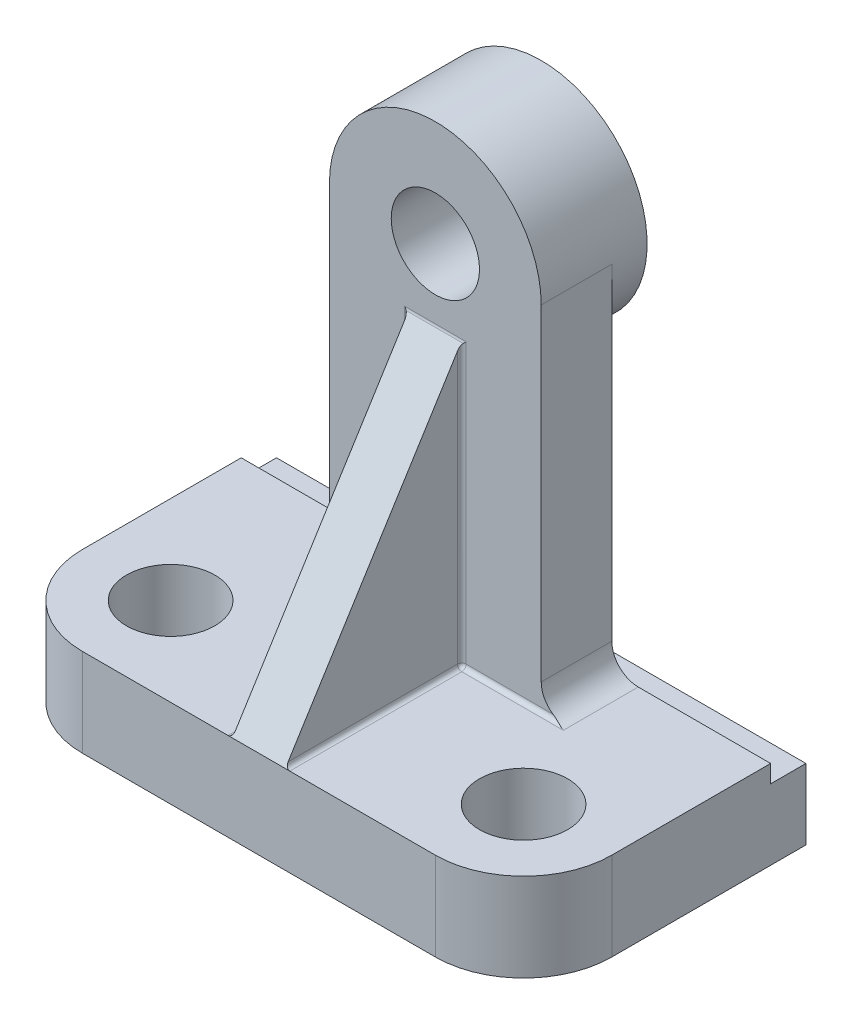
ISO-10303-21;
HEADER;
FILE_DESCRIPTION(('STEP AP214'),'2;1');
FILE_NAME('part.step','',(''),(''),'','','');
FILE_SCHEMA(('AUTOMOTIVE_DESIGN { 1 0 10303 214 1 1 1 1 }'));
ENDSEC;
DATA;
#1=APPLICATION_CONTEXT('core data for automotive mechanical design processes');
#2=APPLICATION_PROTOCOL_DEFINITION('international standard','automotive_design',2000,#1);
#3=PRODUCT_CONTEXT('',#1,'mechanical');
#4=PRODUCT('Part','Part','',(#3));
#5=PRODUCT_RELATED_PRODUCT_CATEGORY('part','',(#4));
#6=PRODUCT_DEFINITION_FORMATION('','',#4);
#7=PRODUCT_DEFINITION_CONTEXT('part definition',#1,'design');
#8=PRODUCT_DEFINITION('design','',#6,#7);
#9=PRODUCT_DEFINITION_SHAPE('','',#8);
#10=(LENGTH_UNIT() NAMED_UNIT(*) SI_UNIT(.MILLI.,.METRE.));
#11=(NAMED_UNIT(*) PLANE_ANGLE_UNIT() SI_UNIT($,.RADIAN.));
#12=(NAMED_UNIT(*) SI_UNIT($,.STERADIAN.) SOLID_ANGLE_UNIT());
#13=UNCERTAINTY_MEASURE_WITH_UNIT(LENGTH_MEASURE(1.E-05),#10,'distance_accuracy_value','');
#14=(GEOMETRIC_REPRESENTATION_CONTEXT(3) GLOBAL_UNCERTAINTY_ASSIGNED_CONTEXT((#13)) GLOBAL_UNIT_ASSIGNED_CONTEXT((#10,
#11,#12)) REPRESENTATION_CONTEXT('',''));
#15=CARTESIAN_POINT('',(0.,0.,0.));
#16=DIRECTION('',(0.,0.,1.));
#17=DIRECTION('',(1.,0.,0.));
#18=AXIS2_PLACEMENT_3D('',#15,#16,#17);
#19=CARTESIAN_POINT('',(-64.708154954579,20.,-20.));
#20=DIRECTION('',(0.,-1.,0.));
#21=DIRECTION('',(0.,0.,-1.));
#22=AXIS2_PLACEMENT_3D('',#19,#20,#21);
#23=PLANE('',#22);
#24=CARTESIAN_POINT('',(15.291845045421,20.,-20.));
#25=DIRECTION('',(0.,1.,0.));
#26=DIRECTION('',(0.,0.,1.));
#27=AXIS2_PLACEMENT_3D('',#24,#25,#26);
#28=CIRCLE('',#27,10.);
#29=CARTESIAN_POINT('',(15.291845045421,20.,-10.));
#30=VERTEX_POINT('',#29);
#31=EDGE_CURVE('E312',#30,#30,#28,.T.);
#32=ORIENTED_EDGE('',*,*,#31,.F.);
#33=EDGE_LOOP('',(#32));
#34=FACE_BOUND('',#33,.T.);
#35=DIRECTION('',(0.,0.,-1.));
#36=VECTOR('',#35,1.);
#37=CARTESIAN_POINT('',(5.29184504542103,20.,-40.));
#38=LINE('',#37,#36);
#39=CARTESIAN_POINT('',(5.29184504542103,20.,-39.));
#40=VERTEX_POINT('',#39);
#41=CARTESIAN_POINT('',(5.291845045421,20.,-56.));
#42=VERTEX_POINT('',#41);
#43=EDGE_CURVE('E272',#40,#42,#38,.T.);
#44=ORIENTED_EDGE('',*,*,#43,.F.);
#45=DIRECTION('',(-1.,0.,0.));
#46=VECTOR('',#45,1.);
#47=CARTESIAN_POINT('',(-64.708154954579,20.,-39.));
#48=LINE('',#47,#46);
#49=CARTESIAN_POINT('',(-17.708154954579,20.,-39.));
#50=VERTEX_POINT('',#49);
#51=EDGE_CURVE('E414',#40,#50,#48,.T.);
#52=ORIENTED_EDGE('',*,*,#51,.T.);
#53=DIRECTION('',(0.,0.,-1.));
#54=VECTOR('',#53,1.);
#55=CARTESIAN_POINT('',(-17.708154954579,20.,0.));
#56=LINE('',#55,#54);
#57=CARTESIAN_POINT('',(-17.7081549545789,20.,0.));
#58=VERTEX_POINT('',#57);
#59=EDGE_CURVE('E410',#50,#58,#56,.F.);
#60=ORIENTED_EDGE('',*,*,#59,.T.);
#61=DIRECTION('',(1.,0.,0.));
#62=VECTOR('',#61,1.);
#63=CARTESIAN_POINT('',(-64.708154954579,20.,0.));
#64=LINE('',#63,#62);
#65=CARTESIAN_POINT('',(15.291845045421,20.,0.));
#66=VERTEX_POINT('',#65);
#67=EDGE_CURVE('E332',#58,#66,#64,.T.);
#68=ORIENTED_EDGE('',*,*,#67,.T.);
#69=CARTESIAN_POINT('',(15.291845045421,20.,-20.));
#70=DIRECTION('',(0.,1.,0.));
#71=DIRECTION('',(0.,0.,1.));
#72=AXIS2_PLACEMENT_3D('',#69,#70,#71);
#73=CIRCLE('',#72,20.);
#74=CARTESIAN_POINT('',(35.291845045421,20.,-20.));
#75=VERTEX_POINT('',#74);
#76=EDGE_CURVE('E337',#66,#75,#73,.T.);
#77=ORIENTED_EDGE('',*,*,#76,.T.);
#78=DIRECTION('',(0.,0.,-1.));
#79=VECTOR('',#78,1.);
#80=CARTESIAN_POINT('',(35.291845045421,20.,-20.));
#81=LINE('',#80,#79);
#82=CARTESIAN_POINT('',(35.291845045421,20.,-56.));
#83=VERTEX_POINT('',#82);
#84=EDGE_CURVE('E340',#75,#83,#81,.T.);
#85=ORIENTED_EDGE('',*,*,#84,.T.);
#86=DIRECTION('',(1.,0.,0.));
#87=VECTOR('',#86,1.);
#88=CARTESIAN_POINT('',(-84.708154954579,20.,-56.));
#89=LINE('',#88,#87);
#90=EDGE_CURVE('E276',#42,#83,#89,.T.);
#91=ORIENTED_EDGE('',*,*,#90,.F.);
#92=EDGE_LOOP('',(#44,#52,#60,#68,#77,#85,#91));
#93=FACE_BOUND('',#92,.T.);
#94=ADVANCED_FACE('F51',(#34,#93),#23,.F.);
#95=CARTESIAN_POINT('',(-84.708154954579,16.,-56.));
#96=DIRECTION('',(0.,0.,1.));
#97=DIRECTION('',(1.,0.,0.));
#98=AXIS2_PLACEMENT_3D('',#95,#96,#97);
#99=PLANE('',#98);
#100=DIRECTION('',(0.,1.,0.));
#101=VECTOR('',#100,1.);
#102=CARTESIAN_POINT('',(-48.708154954579,26.,-56.));
#103=LINE('',#102,#101);
#104=CARTESIAN_POINT('',(-48.708154954579,26.,-56.));
#105=VERTEX_POINT('',#104);
#106=CARTESIAN_POINT('',(-48.708154954579,100.,-56.));
#107=VERTEX_POINT('',#106);
#108=EDGE_CURVE('E216',#105,#107,#103,.T.);
#109=ORIENTED_EDGE('',*,*,#108,.T.);
#110=CARTESIAN_POINT('',(-24.708154954579,100.,-56.));
#111=DIRECTION('',(0.,0.,-1.));
#112=DIRECTION('',(-1.,0.,0.));
#113=AXIS2_PLACEMENT_3D('',#110,#111,#112);
#114=CIRCLE('',#113,24.);
#115=CARTESIAN_POINT('',(-0.708154954578957,100.,-56.));
#116=VERTEX_POINT('',#115);
#117=EDGE_CURVE('E221',#116,#107,#114,.T.);
#118=ORIENTED_EDGE('',*,*,#117,.F.);
#119=DIRECTION('',(0.,-1.,0.));
#120=VECTOR('',#119,1.);
#121=CARTESIAN_POINT('',(-0.70815495457896,100.,-56.));
#122=LINE('',#121,#120);
#123=CARTESIAN_POINT('',(-0.70815495457897,26.,-56.));
#124=VERTEX_POINT('',#123);
#125=EDGE_CURVE('E204',#116,#124,#122,.T.);
#126=ORIENTED_EDGE('',*,*,#125,.T.);
#127=CARTESIAN_POINT('',(5.29184504542103,26.,-56.));
#128=DIRECTION('',(0.,0.,1.));
#129=DIRECTION('',(1.,0.,0.));
#130=AXIS2_PLACEMENT_3D('',#127,#128,#129);
#131=CIRCLE('',#130,6.);
#132=EDGE_CURVE('E215',#124,#42,#131,.T.);
#133=ORIENTED_EDGE('',*,*,#132,.T.);
#134=ORIENTED_EDGE('',*,*,#90,.T.);
#135=DIRECTION('',(0.,1.,0.));
#136=VECTOR('',#135,1.);
#137=CARTESIAN_POINT('',(35.291845045421,16.,-56.));
#138=LINE('',#137,#136);
#139=CARTESIAN_POINT('',(35.291845045421,16.,-56.));
#140=VERTEX_POINT('',#139);
#141=EDGE_CURVE('E305',#140,#83,#138,.T.);
#142=ORIENTED_EDGE('',*,*,#141,.F.);
#143=DIRECTION('',(1.,0.,0.));
#144=VECTOR('',#143,1.);
#145=CARTESIAN_POINT('',(-84.708154954579,16.,-56.));
#146=LINE('',#145,#144);
#147=CARTESIAN_POINT('',(-84.708154954579,16.,-56.));
#148=VERTEX_POINT('',#147);
#149=EDGE_CURVE('E291',#148,#140,#146,.T.);
#150=ORIENTED_EDGE('',*,*,#149,.F.);
#151=DIRECTION('',(0.,1.,0.));
#152=VECTOR('',#151,1.);
#153=CARTESIAN_POINT('',(-84.708154954579,16.,-56.));
#154=LINE('',#153,#152);
#155=CARTESIAN_POINT('',(-84.708154954579,20.,-56.));
#156=VERTEX_POINT('',#155);
#157=EDGE_CURVE('E301',#148,#156,#154,.T.);
#158=ORIENTED_EDGE('',*,*,#157,.T.);
#159=CARTESIAN_POINT('',(-54.708154954579,20.,-56.));
#160=VERTEX_POINT('',#159);
#161=EDGE_CURVE('E292',#156,#160,#89,.T.);
#162=ORIENTED_EDGE('',*,*,#161,.T.);
#163=CARTESIAN_POINT('',(-54.708154954579,26.,-56.));
#164=DIRECTION('',(0.,0.,1.));
#165=DIRECTION('',(1.,0.,0.));
#166=AXIS2_PLACEMENT_3D('',#163,#164,#165);
#167=CIRCLE('',#166,6.);
#168=EDGE_CURVE('E248',#160,#105,#167,.T.);
#169=ORIENTED_EDGE('',*,*,#168,.T.);
#170=EDGE_LOOP('',(#109,#118,#126,#133,#134,#142,#150,#158,#162,#169));
#171=FACE_BOUND('',#170,.T.);
#172=ADVANCED_FACE('F229',(#171),#99,.F.);
#173=CARTESIAN_POINT('',(-84.708154954579,20.,-64.));
#174=DIRECTION('',(0.,0.,1.));
#175=DIRECTION('',(1.,0.,0.));
#176=AXIS2_PLACEMENT_3D('',#173,#174,#175);
#177=PLANE('',#176);
#178=DIRECTION('',(0.,-1.,0.));
#179=VECTOR('',#178,1.);
#180=CARTESIAN_POINT('',(-84.708154954579,20.,-64.));
#181=LINE('',#180,#179);
#182=CARTESIAN_POINT('',(-84.708154954579,16.,-64.));
#183=VERTEX_POINT('',#182);
#184=CARTESIAN_POINT('',(-84.708154954579,0.,-64.));
#185=VERTEX_POINT('',#184);
#186=EDGE_CURVE('E369',#183,#185,#181,.T.);
#187=ORIENTED_EDGE('',*,*,#186,.F.);
#188=DIRECTION('',(-1.,0.,0.));
#189=VECTOR('',#188,1.);
#190=CARTESIAN_POINT('',(-84.708154954579,16.,-64.));
#191=LINE('',#190,#189);
#192=CARTESIAN_POINT('',(35.291845045421,16.,-64.));
#193=VERTEX_POINT('',#192);
#194=EDGE_CURVE('E298',#193,#183,#191,.T.);
#195=ORIENTED_EDGE('',*,*,#194,.F.);
#196=DIRECTION('',(0.,-1.,0.));
#197=VECTOR('',#196,1.);
#198=CARTESIAN_POINT('',(35.291845045421,20.,-64.));
#199=LINE('',#198,#197);
#200=CARTESIAN_POINT('',(35.291845045421,0.,-64.));
#201=VERTEX_POINT('',#200);
#202=EDGE_CURVE('E373',#193,#201,#199,.T.);
#203=ORIENTED_EDGE('',*,*,#202,.T.);
#204=DIRECTION('',(-1.,0.,0.));
#205=VECTOR('',#204,1.);
#206=CARTESIAN_POINT('',(-84.708154954579,0.,-64.));
#207=LINE('',#206,#205);
#208=EDGE_CURVE('E361',#201,#185,#207,.T.);
#209=ORIENTED_EDGE('',*,*,#208,.T.);
#210=EDGE_LOOP('',(#187,#195,#203,#209));
#211=FACE_BOUND('',#210,.T.);
#212=ADVANCED_FACE('F499',(#211),#177,.F.);
#213=DIRECTION('',(-1.,0.,0.));
#214=VECTOR('',#213,1.);
#215=CARTESIAN_POINT('',(-64.708154954579,20.,-39.));
#216=LINE('',#215,#214);
#217=CARTESIAN_POINT('',(-31.708154954579,20.,-39.));
#218=VERTEX_POINT('',#217);
#219=CARTESIAN_POINT('',(-54.708154954579,20.,-39.));
#220=VERTEX_POINT('',#219);
#221=EDGE_CURVE('E391',#218,#220,#216,.T.);
#222=ORIENTED_EDGE('',*,*,#221,.T.);
#223=DIRECTION('',(0.,0.,-1.));
#224=VECTOR('',#223,1.);
#225=CARTESIAN_POINT('',(-54.708154954579,20.,-40.));
#226=LINE('',#225,#224);
#227=EDGE_CURVE('E265',#220,#160,#226,.T.);
#228=ORIENTED_EDGE('',*,*,#227,.T.);
#229=ORIENTED_EDGE('',*,*,#161,.F.);
#230=DIRECTION('',(0.,0.,1.));
#231=VECTOR('',#230,1.);
#232=CARTESIAN_POINT('',(-84.708154954579,20.,-20.0000000000001));
#233=LINE('',#232,#231);
#234=CARTESIAN_POINT('',(-84.708154954579,20.,-20.0000000000001));
#235=VERTEX_POINT('',#234);
#236=EDGE_CURVE('E344',#156,#235,#233,.T.);
#237=ORIENTED_EDGE('',*,*,#236,.T.);
#238=CARTESIAN_POINT('',(-64.708154954579,20.,-20.));
#239=DIRECTION('',(0.,1.,0.));
#240=DIRECTION('',(0.,0.,-1.));
#241=AXIS2_PLACEMENT_3D('',#238,#239,#240);
#242=CIRCLE('',#241,20.);
#243=CARTESIAN_POINT('',(-64.708154954579,20.,0.));
#244=VERTEX_POINT('',#243);
#245=EDGE_CURVE('E328',#235,#244,#242,.T.);
#246=ORIENTED_EDGE('',*,*,#245,.T.);
#247=CARTESIAN_POINT('',(-31.708154954579,20.,0.));
#248=VERTEX_POINT('',#247);
#249=EDGE_CURVE('E334',#244,#248,#64,.T.);
#250=ORIENTED_EDGE('',*,*,#249,.T.);
#251=DIRECTION('',(0.,0.,-1.));
#252=VECTOR('',#251,1.);
#253=CARTESIAN_POINT('',(-31.708154954579,20.,-20.));
#254=LINE('',#253,#252);
#255=EDGE_CURVE('E388',#248,#218,#254,.T.);
#256=ORIENTED_EDGE('',*,*,#255,.T.);
#257=EDGE_LOOP('',(#222,#228,#229,#237,#246,#250,#256));
#258=FACE_BOUND('',#257,.T.);
#259=CARTESIAN_POINT('',(-64.708154954579,20.,-20.));
#260=DIRECTION('',(0.,1.,0.));
#261=DIRECTION('',(0.,0.,1.));
#262=AXIS2_PLACEMENT_3D('',#259,#260,#261);
#263=CIRCLE('',#262,10.);
#264=CARTESIAN_POINT('',(-64.708154954579,20.,-10.));
#265=VERTEX_POINT('',#264);
#266=EDGE_CURVE('E320',#265,#265,#263,.T.);
#267=ORIENTED_EDGE('',*,*,#266,.F.);
#268=EDGE_LOOP('',(#267));
#269=FACE_BOUND('',#268,.T.);
#270=ADVANCED_FACE('F495',(#258,#269),#23,.F.);
#271=CARTESIAN_POINT('',(-64.708154954579,0.,-20.));
#272=DIRECTION('',(0.,-1.,0.));
#273=DIRECTION('',(0.,0.,-1.));
#274=AXIS2_PLACEMENT_3D('',#271,#272,#273);
#275=PLANE('',#274);
#276=DIRECTION('',(0.,0.,1.));
#277=VECTOR('',#276,1.);
#278=CARTESIAN_POINT('',(-84.708154954579,0.,-20.0000000000001));
#279=LINE('',#278,#277);
#280=CARTESIAN_POINT('',(-84.708154954579,0.,-20.0000000000001));
#281=VERTEX_POINT('',#280);
#282=EDGE_CURVE('E333',#185,#281,#279,.T.);
#283=ORIENTED_EDGE('',*,*,#282,.F.);
#284=ORIENTED_EDGE('',*,*,#208,.F.);
#285=DIRECTION('',(0.,0.,-1.));
#286=VECTOR('',#285,1.);
#287=CARTESIAN_POINT('',(35.291845045421,0.,-20.));
#288=LINE('',#287,#286);
#289=CARTESIAN_POINT('',(35.291845045421,0.,-20.));
#290=VERTEX_POINT('',#289);
#291=EDGE_CURVE('E357',#290,#201,#288,.T.);
#292=ORIENTED_EDGE('',*,*,#291,.F.);
#293=CARTESIAN_POINT('',(15.291845045421,0.,-20.));
#294=DIRECTION('',(0.,1.,0.));
#295=DIRECTION('',(0.,0.,1.));
#296=AXIS2_PLACEMENT_3D('',#293,#294,#295);
#297=CIRCLE('',#296,20.);
#298=CARTESIAN_POINT('',(15.291845045421,0.,0.));
#299=VERTEX_POINT('',#298);
#300=EDGE_CURVE('E354',#299,#290,#297,.T.);
#301=ORIENTED_EDGE('',*,*,#300,.F.);
#302=DIRECTION('',(1.,0.,0.));
#303=VECTOR('',#302,1.);
#304=CARTESIAN_POINT('',(-64.708154954579,0.,0.));
#305=LINE('',#304,#303);
#306=CARTESIAN_POINT('',(-64.708154954579,0.,0.));
#307=VERTEX_POINT('',#306);
#308=EDGE_CURVE('E351',#307,#299,#305,.T.);
#309=ORIENTED_EDGE('',*,*,#308,.F.);
#310=CARTESIAN_POINT('',(-64.708154954579,0.,-20.));
#311=DIRECTION('',(0.,1.,0.));
#312=DIRECTION('',(0.,0.,-1.));
#313=AXIS2_PLACEMENT_3D('',#310,#311,#312);
#314=CIRCLE('',#313,20.);
#315=EDGE_CURVE('E324',#281,#307,#314,.T.);
#316=ORIENTED_EDGE('',*,*,#315,.F.);
#317=EDGE_LOOP('',(#283,#284,#292,#301,#309,#316));
#318=FACE_BOUND('',#317,.T.);
#319=CARTESIAN_POINT('',(-64.708154954579,0.,-20.));
#320=DIRECTION('',(0.,1.,0.));
#321=DIRECTION('',(0.,0.,1.));
#322=AXIS2_PLACEMENT_3D('',#319,#320,#321);
#323=CIRCLE('',#322,10.);
#324=CARTESIAN_POINT('',(-64.708154954579,0.,-10.));
#325=VERTEX_POINT('',#324);
#326=EDGE_CURVE('E316',#325,#325,#323,.T.);
#327=ORIENTED_EDGE('',*,*,#326,.T.);
#328=EDGE_LOOP('',(#327));
#329=FACE_BOUND('',#328,.T.);
#330=CARTESIAN_POINT('',(15.291845045421,0.,-20.));
#331=DIRECTION('',(0.,1.,0.));
#332=DIRECTION('',(0.,0.,1.));
#333=AXIS2_PLACEMENT_3D('',#330,#331,#332);
#334=CIRCLE('',#333,10.);
#335=CARTESIAN_POINT('',(15.291845045421,0.,-10.));
#336=VERTEX_POINT('',#335);
#337=EDGE_CURVE('E309',#336,#336,#334,.T.);
#338=ORIENTED_EDGE('',*,*,#337,.T.);
#339=EDGE_LOOP('',(#338));
#340=FACE_BOUND('',#339,.T.);
#341=ADVANCED_FACE('F506',(#318,#329,#340),#275,.T.);
#342=CARTESIAN_POINT('',(-64.708154954579,20.,-20.));
#343=DIRECTION('',(0.,-1.,0.));
#344=DIRECTION('',(0.,0.,-1.));
#345=AXIS2_PLACEMENT_3D('',#342,#343,#344);
#346=CYLINDRICAL_SURFACE('',#345,20.);
#347=ORIENTED_EDGE('',*,*,#315,.T.);
#348=DIRECTION('',(0.,-1.,0.));
#349=VECTOR('',#348,1.);
#350=CARTESIAN_POINT('',(-64.708154954579,20.,0.));
#351=LINE('',#350,#349);
#352=EDGE_CURVE('E384',#244,#307,#351,.T.);
#353=ORIENTED_EDGE('',*,*,#352,.F.);
#354=ORIENTED_EDGE('',*,*,#245,.F.);
#355=DIRECTION('',(0.,-1.,0.));
#356=VECTOR('',#355,1.);
#357=CARTESIAN_POINT('',(-84.708154954579,20.,-20.0000000000001));
#358=LINE('',#357,#356);
#359=EDGE_CURVE('E347',#235,#281,#358,.T.);
#360=ORIENTED_EDGE('',*,*,#359,.T.);
#361=EDGE_LOOP('',(#347,#353,#354,#360));
#362=FACE_BOUND('',#361,.T.);
#363=ADVANCED_FACE('F459',(#362),#346,.T.);
#364=CARTESIAN_POINT('',(-64.708154954579,20.,0.));
#365=DIRECTION('',(0.,0.,-1.));
#366=DIRECTION('',(-1.,0.,0.));
#367=AXIS2_PLACEMENT_3D('',#364,#365,#366);
#368=PLANE('',#367);
#369=ORIENTED_EDGE('',*,*,#308,.T.);
#370=DIRECTION('',(0.,-1.,0.));
#371=VECTOR('',#370,1.);
#372=CARTESIAN_POINT('',(15.291845045421,20.,0.));
#373=LINE('',#372,#371);
#374=EDGE_CURVE('E380',#66,#299,#373,.T.);
#375=ORIENTED_EDGE('',*,*,#374,.F.);
#376=ORIENTED_EDGE('',*,*,#67,.F.);
#377=DIRECTION('',(1.,0.,0.));
#378=VECTOR('',#377,1.);
#379=CARTESIAN_POINT('',(-64.708154954579,20.,0.));
#380=LINE('',#379,#378);
#381=EDGE_CURVE('E71',#248,#58,#380,.T.);
#382=ORIENTED_EDGE('',*,*,#381,.F.);
#383=ORIENTED_EDGE('',*,*,#249,.F.);
#384=ORIENTED_EDGE('',*,*,#352,.T.);
#385=EDGE_LOOP('',(#369,#375,#376,#382,#383,#384));
#386=FACE_BOUND('',#385,.T.);
#387=ADVANCED_FACE('F636',(#386),#368,.F.);
#388=CARTESIAN_POINT('',(15.291845045421,20.,-20.));
#389=DIRECTION('',(0.,-1.,0.));
#390=DIRECTION('',(0.,0.,-1.));
#391=AXIS2_PLACEMENT_3D('',#388,#389,#390);
#392=CYLINDRICAL_SURFACE('',#391,20.);
#393=ORIENTED_EDGE('',*,*,#300,.T.);
#394=DIRECTION('',(0.,-1.,0.));
#395=VECTOR('',#394,1.);
#396=CARTESIAN_POINT('',(35.291845045421,20.,-20.));
#397=LINE('',#396,#395);
#398=EDGE_CURVE('E376',#75,#290,#397,.T.);
#399=ORIENTED_EDGE('',*,*,#398,.F.);
#400=ORIENTED_EDGE('',*,*,#76,.F.);
#401=ORIENTED_EDGE('',*,*,#374,.T.);
#402=EDGE_LOOP('',(#393,#399,#400,#401));
#403=FACE_BOUND('',#402,.T.);
#404=ADVANCED_FACE('F893',(#403),#392,.T.);
#405=CARTESIAN_POINT('',(35.291845045421,20.,-20.));
#406=DIRECTION('',(-1.,0.,0.));
#407=DIRECTION('',(0.,0.,1.));
#408=AXIS2_PLACEMENT_3D('',#405,#406,#407);
#409=PLANE('',#408);
#410=DIRECTION('',(0.,0.,-1.));
#411=VECTOR('',#410,1.);
#412=CARTESIAN_POINT('',(35.291845045421,16.,-64.));
#413=LINE('',#412,#411);
#414=EDGE_CURVE('E295',#140,#193,#413,.T.);
#415=ORIENTED_EDGE('',*,*,#414,.F.);
#416=ORIENTED_EDGE('',*,*,#141,.T.);
#417=ORIENTED_EDGE('',*,*,#84,.F.);
#418=ORIENTED_EDGE('',*,*,#398,.T.);
#419=ORIENTED_EDGE('',*,*,#291,.T.);
#420=ORIENTED_EDGE('',*,*,#202,.F.);
#421=EDGE_LOOP('',(#415,#416,#417,#418,#419,#420));
#422=FACE_BOUND('',#421,.T.);
#423=ADVANCED_FACE('F551',(#422),#409,.F.);
#424=CARTESIAN_POINT('',(-84.708154954579,20.,-20.0000000000001));
#425=DIRECTION('',(1.,0.,0.));
#426=DIRECTION('',(0.,0.,-1.));
#427=AXIS2_PLACEMENT_3D('',#424,#425,#426);
#428=PLANE('',#427);
#429=ORIENTED_EDGE('',*,*,#236,.F.);
#430=ORIENTED_EDGE('',*,*,#157,.F.);
#431=DIRECTION('',(0.,0.,1.));
#432=VECTOR('',#431,1.);
#433=CARTESIAN_POINT('',(-84.708154954579,16.,-64.));
#434=LINE('',#433,#432);
#435=EDGE_CURVE('E287',#183,#148,#434,.T.);
#436=ORIENTED_EDGE('',*,*,#435,.F.);
#437=ORIENTED_EDGE('',*,*,#186,.T.);
#438=ORIENTED_EDGE('',*,*,#282,.T.);
#439=ORIENTED_EDGE('',*,*,#359,.F.);
#440=EDGE_LOOP('',(#429,#430,#436,#437,#438,#439));
#441=FACE_BOUND('',#440,.T.);
#442=ADVANCED_FACE('F523',(#441),#428,.F.);
#443=CARTESIAN_POINT('',(-64.708154954579,20.,-20.));
#444=DIRECTION('',(0.,-1.,0.));
#445=DIRECTION('',(0.,0.,-1.));
#446=AXIS2_PLACEMENT_3D('',#443,#444,#445);
#447=CYLINDRICAL_SURFACE('',#446,10.);
#448=ORIENTED_EDGE('',*,*,#266,.T.);
#449=EDGE_LOOP('',(#448));
#450=FACE_BOUND('',#449,.T.);
#451=ORIENTED_EDGE('',*,*,#326,.F.);
#452=EDGE_LOOP('',(#451));
#453=FACE_BOUND('',#452,.T.);
#454=ADVANCED_FACE('F519',(#450,#453),#447,.F.);
#455=CARTESIAN_POINT('',(15.291845045421,20.,-20.));
#456=DIRECTION('',(0.,-1.,0.));
#457=DIRECTION('',(0.,0.,-1.));
#458=AXIS2_PLACEMENT_3D('',#455,#456,#457);
#459=CYLINDRICAL_SURFACE('',#458,10.);
#460=ORIENTED_EDGE('',*,*,#31,.T.);
#461=EDGE_LOOP('',(#460));
#462=FACE_BOUND('',#461,.T.);
#463=ORIENTED_EDGE('',*,*,#337,.F.);
#464=EDGE_LOOP('',(#463));
#465=FACE_BOUND('',#464,.T.);
#466=ADVANCED_FACE('F522',(#462,#465),#459,.F.);
#467=CARTESIAN_POINT('',(0.,16.,0.));
#468=DIRECTION('',(0.,1.,0.));
#469=DIRECTION('',(0.,0.,1.));
#470=AXIS2_PLACEMENT_3D('',#467,#468,#469);
#471=PLANE('',#470);
#472=ORIENTED_EDGE('',*,*,#149,.T.);
#473=ORIENTED_EDGE('',*,*,#414,.T.);
#474=ORIENTED_EDGE('',*,*,#194,.T.);
#475=ORIENTED_EDGE('',*,*,#435,.T.);
#476=EDGE_LOOP('',(#472,#473,#474,#475));
#477=FACE_BOUND('',#476,.T.);
#478=ADVANCED_FACE('F530',(#477),#471,.T.);
#479=CARTESIAN_POINT('',(5.29184504542103,26.,-40.));
#480=DIRECTION('',(0.,0.,-1.));
#481=DIRECTION('',(-1.,0.,0.));
#482=AXIS2_PLACEMENT_3D('',#479,#480,#481);
#483=CYLINDRICAL_SURFACE('',#482,6.);
#484=ORIENTED_EDGE('',*,*,#132,.F.);
#485=DIRECTION('',(0.,0.,-1.));
#486=VECTOR('',#485,1.);
#487=CARTESIAN_POINT('',(-0.70815495457897,26.,-40.));
#488=LINE('',#487,#486);
#489=CARTESIAN_POINT('',(-0.70815495457897,26.,-40.));
#490=VERTEX_POINT('',#489);
#491=EDGE_CURVE('E210',#490,#124,#488,.T.);
#492=ORIENTED_EDGE('',*,*,#491,.F.);
#493=CARTESIAN_POINT('',(5.29184504542103,26.,-40.));
#494=DIRECTION('',(0.,0.,1.));
#495=DIRECTION('',(1.,0.,0.));
#496=AXIS2_PLACEMENT_3D('',#493,#494,#495);
#497=CIRCLE('',#496,6.);
#498=CARTESIAN_POINT('',(1.97522025506564,21.,-40.));
#499=VERTEX_POINT('',#498);
#500=EDGE_CURVE('E261',#490,#499,#497,.T.);
#501=ORIENTED_EDGE('',*,*,#500,.T.);
#502=CARTESIAN_POINT('',(1.97522025506564,21.,-40.));
#503=CARTESIAN_POINT('',(2.04595579507455,20.9530692628139,-39.999960889859));
#504=CARTESIAN_POINT('',(2.11763433057041,20.9076944713355,-39.9967001292477));
#505=CARTESIAN_POINT('',(2.26240212421996,20.8202715688812,-39.9847128710553));
#506=CARTESIAN_POINT('',(2.33548895884603,20.7782182846166,-39.9759950697934));
#507=CARTESIAN_POINT('',(2.48243694010388,20.6977158008875,-39.9541228058013));
#508=CARTESIAN_POINT('',(2.55629197464505,20.6592487724963,-39.940991971183));
#509=CARTESIAN_POINT('',(2.70495345474136,20.5856788043009,-39.9109976720676));
#510=CARTESIAN_POINT('',(2.77976042209126,20.5505778082295,-39.8941320692889));
#511=CARTESIAN_POINT('',(2.99078085339373,20.4567882720513,-39.8424252200398));
#512=CARTESIAN_POINT('',(3.12784316420478,20.4019175146588,-39.8040595026935));
#513=CARTESIAN_POINT('',(3.40360942857672,20.3029786219461,-39.7199831439616));
#514=CARTESIAN_POINT('',(3.54231424209158,20.2589164338242,-39.6742684817623));
#515=CARTESIAN_POINT('',(3.82127238940353,20.1811988817157,-39.5774342802611));
#516=CARTESIAN_POINT('',(3.96152931317533,20.1475781776246,-39.5262974802128));
#517=CARTESIAN_POINT('',(4.24270498292374,20.0906961784226,-39.4204457568417));
#518=CARTESIAN_POINT('',(4.38362342655457,20.0674305430729,-39.3657323436749));
#519=CARTESIAN_POINT('',(4.65008886876781,20.0330811465728,-39.2603565807877));
#520=CARTESIAN_POINT('',(4.77559213257536,20.0209258704582,-39.2099256489211));
#521=CARTESIAN_POINT('',(5.02657329581897,20.0045503704676,-39.1082817271839));
#522=CARTESIAN_POINT('',(5.15205089042001,20.0003169856652,-39.0570701771716));
#523=CARTESIAN_POINT('',(5.28228325194696,20.0000057158814,-39.0039035853255));
#524=CARTESIAN_POINT('',(5.28706417095817,20.0000000018403,-39.0019517831563));
#525=CARTESIAN_POINT('',(5.29184504542103,20.,-39.));
#526=B_SPLINE_CURVE_WITH_KNOTS('',3,(#502,#503,#504,#505,#506,#507,#508,#509,#510,#511,#512,
#513,#514,#515,#516,#517,#518,#519,#520,#521,#522,#523,#524,#525),.UNSPECIFIED.,.F.,.F.,(4,2,2,
2,2,2,2,2,2,2,2,4),(0.,0.254478765589331,0.508553023606619,0.761288041690675,1.01416813500991,
1.47107229962254,1.92822730548707,2.38688397976833,2.84534823055554,3.25253093781937,
3.65903657498634,3.6745285178593),.UNSPECIFIED.);
#527=EDGE_CURVE('E441',#499,#40,#526,.T.);
#528=ORIENTED_EDGE('',*,*,#527,.T.);
#529=ORIENTED_EDGE('',*,*,#43,.T.);
#530=EDGE_LOOP('',(#484,#492,#501,#528,#529));
#531=FACE_BOUND('',#530,.T.);
#532=ADVANCED_FACE('F536',(#531),#483,.F.);
#533=CARTESIAN_POINT('',(-0.70815495457896,100.,-40.));
#534=DIRECTION('',(1.,0.,0.));
#535=DIRECTION('',(0.,1.,0.));
#536=AXIS2_PLACEMENT_3D('',#533,#534,#535);
#537=PLANE('',#536);
#538=ORIENTED_EDGE('',*,*,#125,.F.);
#539=DIRECTION('',(0.,0.,-1.));
#540=VECTOR('',#539,1.);
#541=CARTESIAN_POINT('',(-0.70815495457896,100.,-40.));
#542=LINE('',#541,#540);
#543=CARTESIAN_POINT('',(-0.70815495457896,100.,-40.));
#544=VERTEX_POINT('',#543);
#545=EDGE_CURVE('E208',#544,#116,#542,.T.);
#546=ORIENTED_EDGE('',*,*,#545,.F.);
#547=DIRECTION('',(0.,-1.,0.));
#548=VECTOR('',#547,1.);
#549=CARTESIAN_POINT('',(-0.70815495457896,100.,-40.));
#550=LINE('',#549,#548);
#551=EDGE_CURVE('E258',#544,#490,#550,.T.);
#552=ORIENTED_EDGE('',*,*,#551,.T.);
#553=ORIENTED_EDGE('',*,*,#491,.T.);
#554=EDGE_LOOP('',(#538,#546,#552,#553));
#555=FACE_BOUND('',#554,.T.);
#556=ADVANCED_FACE('F206',(#555),#537,.T.);
#557=CARTESIAN_POINT('',(-24.708154954579,100.,-40.));
#558=DIRECTION('',(0.,0.,-1.));
#559=DIRECTION('',(-1.,0.,0.));
#560=AXIS2_PLACEMENT_3D('',#557,#558,#559);
#561=CYLINDRICAL_SURFACE('',#560,24.);
#562=CARTESIAN_POINT('',(-24.708154954579,100.,-64.));
#563=DIRECTION('',(0.,0.,-1.));
#564=DIRECTION('',(-1.,0.,0.));
#565=AXIS2_PLACEMENT_3D('',#562,#563,#564);
#566=CIRCLE('',#565,24.);
#567=CARTESIAN_POINT('',(-48.708154954579,100.,-64.));
#568=VERTEX_POINT('',#567);
#569=EDGE_CURVE('E233',#568,#568,#566,.T.);
#570=ORIENTED_EDGE('',*,*,#569,.F.);
#571=EDGE_LOOP('',(#570));
#572=FACE_BOUND('',#571,.T.);
#573=ORIENTED_EDGE('',*,*,#117,.T.);
#574=DIRECTION('',(0.,0.,-1.));
#575=VECTOR('',#574,1.);
#576=CARTESIAN_POINT('',(-48.708154954579,100.,-40.));
#577=LINE('',#576,#575);
#578=CARTESIAN_POINT('',(-48.708154954579,100.,-40.));
#579=VERTEX_POINT('',#578);
#580=EDGE_CURVE('E226',#579,#107,#577,.T.);
#581=ORIENTED_EDGE('',*,*,#580,.F.);
#582=CARTESIAN_POINT('',(-24.708154954579,100.,-40.));
#583=DIRECTION('',(0.,0.,-1.));
#584=DIRECTION('',(-1.,0.,0.));
#585=AXIS2_PLACEMENT_3D('',#582,#583,#584);
#586=CIRCLE('',#585,24.);
#587=EDGE_CURVE('E224',#579,#544,#586,.T.);
#588=ORIENTED_EDGE('',*,*,#587,.T.);
#589=ORIENTED_EDGE('',*,*,#545,.T.);
#590=EDGE_LOOP('',(#573,#581,#588,#589));
#591=FACE_BOUND('',#590,.T.);
#592=ADVANCED_FACE('F220',(#572,#591),#561,.T.);
#593=CARTESIAN_POINT('',(-48.708154954579,26.,-40.));
#594=DIRECTION('',(-1.,0.,0.));
#595=DIRECTION('',(0.,0.,1.));
#596=AXIS2_PLACEMENT_3D('',#593,#594,#595);
#597=PLANE('',#596);
#598=ORIENTED_EDGE('',*,*,#108,.F.);
#599=DIRECTION('',(0.,0.,-1.));
#600=VECTOR('',#599,1.);
#601=CARTESIAN_POINT('',(-48.708154954579,26.,-40.));
#602=LINE('',#601,#600);
#603=CARTESIAN_POINT('',(-48.708154954579,26.,-40.));
#604=VERTEX_POINT('',#603);
#605=EDGE_CURVE('E281',#604,#105,#602,.T.);
#606=ORIENTED_EDGE('',*,*,#605,.F.);
#607=DIRECTION('',(0.,1.,0.));
#608=VECTOR('',#607,1.);
#609=CARTESIAN_POINT('',(-48.708154954579,26.,-40.));
#610=LINE('',#609,#608);
#611=EDGE_CURVE('E252',#604,#579,#610,.T.);
#612=ORIENTED_EDGE('',*,*,#611,.T.);
#613=ORIENTED_EDGE('',*,*,#580,.T.);
#614=EDGE_LOOP('',(#598,#606,#612,#613));
#615=FACE_BOUND('',#614,.T.);
#616=ADVANCED_FACE('F685',(#615),#597,.T.);
#617=CARTESIAN_POINT('',(-54.708154954579,26.,-40.));
#618=DIRECTION('',(0.,0.,-1.));
#619=DIRECTION('',(-1.,0.,0.));
#620=AXIS2_PLACEMENT_3D('',#617,#618,#619);
#621=CYLINDRICAL_SURFACE('',#620,6.);
#622=ORIENTED_EDGE('',*,*,#168,.F.);
#623=ORIENTED_EDGE('',*,*,#227,.F.);
#624=CARTESIAN_POINT('',(-51.3915301642236,21.,-40.));
#625=CARTESIAN_POINT('',(-51.4622657042326,20.9530692628138,-39.999960889859));
#626=CARTESIAN_POINT('',(-51.5339442397287,20.9076944713354,-39.9967001292477));
#627=CARTESIAN_POINT('',(-51.6787120333785,20.8202715688808,-39.9847128710552));
#628=CARTESIAN_POINT('',(-51.7517988680048,20.7782182846162,-39.9759950697933));
#629=CARTESIAN_POINT('',(-51.8987468492627,20.6977158008871,-39.9541228058011));
#630=CARTESIAN_POINT('',(-51.9726018838037,20.659248772496,-39.9409919711828));
#631=CARTESIAN_POINT('',(-52.1212633638997,20.5856788043008,-39.9109976720675));
#632=CARTESIAN_POINT('',(-52.1960703312494,20.5505778082294,-39.8941320692888));
#633=CARTESIAN_POINT('',(-52.4070907625516,20.4567882720514,-39.8424252200399));
#634=CARTESIAN_POINT('',(-52.5441530733625,20.4019175146589,-39.8040595026935));
#635=CARTESIAN_POINT('',(-52.8199193377342,20.3029786219463,-39.7199831439618));
#636=CARTESIAN_POINT('',(-52.958624151249,20.2589164338243,-39.6742684817626));
#637=CARTESIAN_POINT('',(-53.2375822985609,20.1811988817159,-39.5774342802612));
#638=CARTESIAN_POINT('',(-53.3778392223327,20.1475781776246,-39.5262974802126));
#639=CARTESIAN_POINT('',(-53.6590148920817,20.0906961784226,-39.4204457568421));
#640=CARTESIAN_POINT('',(-53.799933335713,20.0674305430729,-39.3657323436763));
#641=CARTESIAN_POINT('',(-54.0663987779253,20.0330811465728,-39.2603565807865));
#642=CARTESIAN_POINT('',(-54.1919020417316,20.0209258704582,-39.2099256489167));
#643=CARTESIAN_POINT('',(-54.4428832049788,20.0045503704677,-39.1082817271883));
#644=CARTESIAN_POINT('',(-54.5683607995847,20.0003169856653,-39.057070177188));
#645=CARTESIAN_POINT('',(-54.6985931611054,20.0000057158814,-39.0039035853267));
#646=CARTESIAN_POINT('',(-54.7033740801164,20.0000000018403,-39.001951783157));
#647=CARTESIAN_POINT('',(-54.708154954579,20.,-39.));
#648=B_SPLINE_CURVE_WITH_KNOTS('',3,(#624,#625,#626,#627,#628,#629,#630,#631,#632,#633,#634,
#635,#636,#637,#638,#639,#640,#641,#642,#643,#644,#645,#646,#647),.UNSPECIFIED.,.F.,.F.,(4,2,2,
2,2,2,2,2,2,2,2,4),(0.,0.254478765589873,0.508553023607736,0.761288041691247,1.01416813500992,
1.47107229962212,1.92822730548632,2.38688397976803,2.8453482305556,3.25253093781942,
3.65903657498633,3.67452851785929),.UNSPECIFIED.);
#649=CARTESIAN_POINT('',(-51.3915301642236,21.,-40.));
#650=VERTEX_POINT('',#649);
#651=EDGE_CURVE('E432',#220,#650,#648,.F.);
#652=ORIENTED_EDGE('',*,*,#651,.T.);
#653=CARTESIAN_POINT('',(-54.708154954579,26.,-40.));
#654=DIRECTION('',(0.,0.,1.));
#655=DIRECTION('',(1.,0.,0.));
#656=AXIS2_PLACEMENT_3D('',#653,#654,#655);
#657=CIRCLE('',#656,6.);
#658=EDGE_CURVE('E249',#650,#604,#657,.T.);
#659=ORIENTED_EDGE('',*,*,#658,.T.);
#660=ORIENTED_EDGE('',*,*,#605,.T.);
#661=EDGE_LOOP('',(#622,#623,#652,#659,#660));
#662=FACE_BOUND('',#661,.T.);
#663=ADVANCED_FACE('F448',(#662),#621,.F.);
#664=CARTESIAN_POINT('',(-54.708154954579,26.,-40.));
#665=DIRECTION('',(0.,0.,1.));
#666=DIRECTION('',(1.,0.,0.));
#667=AXIS2_PLACEMENT_3D('',#664,#665,#666);
#668=PLANE('',#667);
#669=ORIENTED_EDGE('',*,*,#658,.F.);
#670=DIRECTION('',(-1.,0.,0.));
#671=VECTOR('',#670,1.);
#672=CARTESIAN_POINT('',(-54.708154954579,21.,-40.));
#673=LINE('',#672,#671);
#674=CARTESIAN_POINT('',(-31.708154954579,21.,-40.));
#675=VERTEX_POINT('',#674);
#676=EDGE_CURVE('E407',#650,#675,#673,.F.);
#677=ORIENTED_EDGE('',*,*,#676,.T.);
#678=DIRECTION('',(0.,-1.,0.));
#679=VECTOR('',#678,1.);
#680=CARTESIAN_POINT('',(-31.708154954579,84.,-40.));
#681=LINE('',#680,#679);
#682=CARTESIAN_POINT('',(-31.708154954579,84.2867962264113,-40.));
#683=VERTEX_POINT('',#682);
#684=EDGE_CURVE('E398',#675,#683,#681,.F.);
#685=ORIENTED_EDGE('',*,*,#684,.T.);
#686=DIRECTION('',(-1.,0.,0.));
#687=VECTOR('',#686,1.);
#688=CARTESIAN_POINT('',(-18.708154954579,84.2867962264113,-40.));
#689=LINE('',#688,#687);
#690=CARTESIAN_POINT('',(-17.708154954579,84.2867962264113,-40.));
#691=VERTEX_POINT('',#690);
#692=EDGE_CURVE('E395',#683,#691,#689,.F.);
#693=ORIENTED_EDGE('',*,*,#692,.T.);
#694=DIRECTION('',(0.,-1.,0.));
#695=VECTOR('',#694,1.);
#696=CARTESIAN_POINT('',(-17.708154954579,26.,-40.));
#697=LINE('',#696,#695);
#698=CARTESIAN_POINT('',(-17.708154954579,21.,-40.));
#699=VERTEX_POINT('',#698);
#700=EDGE_CURVE('E401',#691,#699,#697,.T.);
#701=ORIENTED_EDGE('',*,*,#700,.T.);
#702=DIRECTION('',(-1.,0.,0.));
#703=VECTOR('',#702,1.);
#704=CARTESIAN_POINT('',(-54.708154954579,21.,-40.));
#705=LINE('',#704,#703);
#706=EDGE_CURVE('E404',#699,#499,#705,.F.);
#707=ORIENTED_EDGE('',*,*,#706,.T.);
#708=ORIENTED_EDGE('',*,*,#500,.F.);
#709=ORIENTED_EDGE('',*,*,#551,.F.);
#710=ORIENTED_EDGE('',*,*,#587,.F.);
#711=ORIENTED_EDGE('',*,*,#611,.F.);
#712=EDGE_LOOP('',(#669,#677,#685,#693,#701,#707,#708,#709,#710,#711));
#713=FACE_BOUND('',#712,.T.);
#714=CARTESIAN_POINT('',(-24.708154954579,100.,-40.));
#715=DIRECTION('',(0.,0.,-1.));
#716=DIRECTION('',(-1.,0.,0.));
#717=AXIS2_PLACEMENT_3D('',#714,#715,#716);
#718=CIRCLE('',#717,10.);
#719=CARTESIAN_POINT('',(-34.708154954579,100.,-40.));
#720=VERTEX_POINT('',#719);
#721=EDGE_CURVE('E240',#720,#720,#718,.T.);
#722=ORIENTED_EDGE('',*,*,#721,.T.);
#723=EDGE_LOOP('',(#722));
#724=FACE_BOUND('',#723,.T.);
#725=ADVANCED_FACE('F569',(#713,#724),#668,.T.);
#726=CARTESIAN_POINT('',(-24.708154954579,100.,-40.));
#727=DIRECTION('',(0.,0.,-1.));
#728=DIRECTION('',(-1.,0.,0.));
#729=AXIS2_PLACEMENT_3D('',#726,#727,#728);
#730=CYLINDRICAL_SURFACE('',#729,10.);
#731=CARTESIAN_POINT('',(-24.708154954579,100.,-64.));
#732=DIRECTION('',(0.,0.,-1.));
#733=DIRECTION('',(-1.,0.,0.));
#734=AXIS2_PLACEMENT_3D('',#731,#732,#733);
#735=CIRCLE('',#734,10.);
#736=CARTESIAN_POINT('',(-34.708154954579,100.,-64.));
#737=VERTEX_POINT('',#736);
#738=EDGE_CURVE('E234',#737,#737,#735,.T.);
#739=ORIENTED_EDGE('',*,*,#738,.T.);
#740=EDGE_LOOP('',(#739));
#741=FACE_BOUND('',#740,.T.);
#742=ORIENTED_EDGE('',*,*,#721,.F.);
#743=EDGE_LOOP('',(#742));
#744=FACE_BOUND('',#743,.T.);
#745=ADVANCED_FACE('F674',(#741,#744),#730,.F.);
#746=CARTESIAN_POINT('',(-24.708154954579,100.,-64.));
#747=DIRECTION('',(0.,0.,-1.));
#748=DIRECTION('',(-1.,0.,0.));
#749=AXIS2_PLACEMENT_3D('',#746,#747,#748);
#750=PLANE('',#749);
#751=ORIENTED_EDGE('',*,*,#738,.F.);
#752=EDGE_LOOP('',(#751));
#753=FACE_BOUND('',#752,.T.);
#754=ORIENTED_EDGE('',*,*,#569,.T.);
#755=EDGE_LOOP('',(#754));
#756=FACE_BOUND('',#755,.T.);
#757=ADVANCED_FACE('F671',(#753,#756),#750,.T.);
#758=CARTESIAN_POINT('',(-24.708154954579,20.,0.));
#759=DIRECTION('',(0.,0.52999894000318,0.847998304005088));
#760=DIRECTION('',(0.,0.847998304005088,-0.52999894000318));
#761=AXIS2_PLACEMENT_3D('',#758,#759,#760);
#762=PLANE('',#761);
#763=CARTESIAN_POINT('',(-17.708154954579,82.4,-39.));
#764=DIRECTION('',(0.,0.52999894000318,0.847998304005088));
#765=DIRECTION('',(0.,-0.847998304005088,0.52999894000318));
#766=AXIS2_PLACEMENT_3D('',#763,#764,#765);
#767=ELLIPSE('',#766,1.88679622641132,1.);
#768=CARTESIAN_POINT('',(-18.708154954579,82.4,-39.));
#769=VERTEX_POINT('',#768);
#770=CARTESIAN_POINT('',(-18.2381538945902,83.7567972864082,-39.8479983040051));
#771=VERTEX_POINT('',#770);
#772=EDGE_CURVE('E63',#769,#771,#767,.F.);
#773=ORIENTED_EDGE('',*,*,#772,.T.);
#774=DIRECTION('',(-1.,0.,0.));
#775=VECTOR('',#774,1.);
#776=CARTESIAN_POINT('',(-30.708154954579,83.7567972864082,-39.8479983040051));
#777=LINE('',#776,#775);
#778=CARTESIAN_POINT('',(-31.1781560145677,83.7567972864082,-39.8479983040051));
#779=VERTEX_POINT('',#778);
#780=EDGE_CURVE('E429',#771,#779,#777,.T.);
#781=ORIENTED_EDGE('',*,*,#780,.T.);
#782=CARTESIAN_POINT('',(-31.708154954579,82.4,-39.));
#783=DIRECTION('',(0.,0.52999894000318,0.847998304005088));
#784=DIRECTION('',(0.,0.847998304005088,-0.52999894000318));
#785=AXIS2_PLACEMENT_3D('',#782,#783,#784);
#786=ELLIPSE('',#785,1.88679622641132,1.);
#787=CARTESIAN_POINT('',(-30.708154954579,82.4,-39.));
#788=VERTEX_POINT('',#787);
#789=EDGE_CURVE('E13',#779,#788,#786,.F.);
#790=ORIENTED_EDGE('',*,*,#789,.T.);
#791=DIRECTION('',(0.,0.847998304005088,-0.52999894000318));
#792=VECTOR('',#791,1.);
#793=CARTESIAN_POINT('',(-30.708154954579,20.,0.));
#794=LINE('',#793,#792);
#795=CARTESIAN_POINT('',(-30.708154954579,21.,-0.625000000000003));
#796=VERTEX_POINT('',#795);
#797=EDGE_CURVE('E613',#796,#788,#794,.T.);
#798=ORIENTED_EDGE('',*,*,#797,.F.);
#799=CARTESIAN_POINT('',(-31.708154954579,21.,-0.625000000000004));
#800=DIRECTION('',(0.,0.52999894000318,0.847998304005088));
#801=DIRECTION('',(0.,0.847998304005088,-0.52999894000318));
#802=AXIS2_PLACEMENT_3D('',#799,#800,#801);
#803=ELLIPSE('',#802,1.17924764150708,1.);
#804=EDGE_CURVE('E631',#796,#248,#803,.F.);
#805=ORIENTED_EDGE('',*,*,#804,.T.);
#806=ORIENTED_EDGE('',*,*,#381,.T.);
#807=CARTESIAN_POINT('',(-17.708154954579,21.,-0.625000000000001));
#808=DIRECTION('',(0.,0.52999894000318,0.847998304005088));
#809=DIRECTION('',(0.,-0.847998304005088,0.52999894000318));
#810=AXIS2_PLACEMENT_3D('',#807,#808,#809);
#811=ELLIPSE('',#810,1.17924764150708,1.);
#812=CARTESIAN_POINT('',(-18.7081549545789,21.,-0.625000000000002));
#813=VERTEX_POINT('',#812);
#814=EDGE_CURVE('E628',#58,#813,#811,.F.);
#815=ORIENTED_EDGE('',*,*,#814,.T.);
#816=DIRECTION('',(0.,0.847998304005088,-0.52999894000318));
#817=VECTOR('',#816,1.);
#818=CARTESIAN_POINT('',(-18.7081549545789,20.,0.));
#819=LINE('',#818,#817);
#820=EDGE_CURVE('E608',#813,#769,#819,.T.);
#821=ORIENTED_EDGE('',*,*,#820,.T.);
#822=EDGE_LOOP('',(#773,#781,#790,#798,#805,#806,#815,#821));
#823=FACE_BOUND('',#822,.T.);
#824=ADVANCED_FACE('F627',(#823),#762,.T.);
#825=CARTESIAN_POINT('',(-30.708154954579,62.,-32.));
#826=DIRECTION('',(-1.,0.,0.));
#827=DIRECTION('',(0.,0.,1.));
#828=AXIS2_PLACEMENT_3D('',#825,#826,#827);
#829=PLANE('',#828);
#830=DIRECTION('',(0.,-1.,0.));
#831=VECTOR('',#830,1.);
#832=CARTESIAN_POINT('',(-30.708154954579,20.,-39.));
#833=LINE('',#832,#831);
#834=CARTESIAN_POINT('',(-30.708154954579,21.,-39.));
#835=VERTEX_POINT('',#834);
#836=EDGE_CURVE('E417',#788,#835,#833,.T.);
#837=ORIENTED_EDGE('',*,*,#836,.T.);
#838=DIRECTION('',(0.,0.,-1.));
#839=VECTOR('',#838,1.);
#840=CARTESIAN_POINT('',(-30.708154954579,21.,-32.));
#841=LINE('',#840,#839);
#842=EDGE_CURVE('E420',#835,#796,#841,.F.);
#843=ORIENTED_EDGE('',*,*,#842,.T.);
#844=ORIENTED_EDGE('',*,*,#797,.T.);
#845=EDGE_LOOP('',(#837,#843,#844));
#846=FACE_BOUND('',#845,.T.);
#847=ADVANCED_FACE('F661',(#846),#829,.T.);
#848=CARTESIAN_POINT('',(-18.708154954579,62.,-32.));
#849=DIRECTION('',(-1.,0.,0.));
#850=DIRECTION('',(0.,0.,1.));
#851=AXIS2_PLACEMENT_3D('',#848,#849,#850);
#852=PLANE('',#851);
#853=ORIENTED_EDGE('',*,*,#820,.F.);
#854=DIRECTION('',(0.,0.,-1.));
#855=VECTOR('',#854,1.);
#856=CARTESIAN_POINT('',(-18.708154954579,21.,-40.));
#857=LINE('',#856,#855);
#858=CARTESIAN_POINT('',(-18.708154954579,21.,-39.));
#859=VERTEX_POINT('',#858);
#860=EDGE_CURVE('E426',#813,#859,#857,.T.);
#861=ORIENTED_EDGE('',*,*,#860,.T.);
#862=DIRECTION('',(0.,-1.,0.));
#863=VECTOR('',#862,1.);
#864=CARTESIAN_POINT('',(-18.708154954579,62.,-39.));
#865=LINE('',#864,#863);
#866=EDGE_CURVE('E423',#859,#769,#865,.F.);
#867=ORIENTED_EDGE('',*,*,#866,.T.);
#868=EDGE_LOOP('',(#853,#861,#867));
#869=FACE_BOUND('',#868,.T.);
#870=ADVANCED_FACE('F489',(#869),#852,.F.);
#871=CARTESIAN_POINT('',(-64.708154954579,21.,-39.));
#872=DIRECTION('',(-1.,0.,0.));
#873=DIRECTION('',(0.,0.,1.));
#874=AXIS2_PLACEMENT_3D('',#871,#872,#873);
#875=CYLINDRICAL_SURFACE('',#874,1.);
#876=ORIENTED_EDGE('',*,*,#527,.F.);
#877=ORIENTED_EDGE('',*,*,#706,.F.);
#878=CARTESIAN_POINT('',(-17.708154954579,21.,-39.));
#879=DIRECTION('',(1.,0.,0.));
#880=DIRECTION('',(0.,0.,-1.));
#881=AXIS2_PLACEMENT_3D('',#878,#879,#880);
#882=CIRCLE('',#881,1.);
#883=EDGE_CURVE('E56',#50,#699,#882,.T.);
#884=ORIENTED_EDGE('',*,*,#883,.F.);
#885=ORIENTED_EDGE('',*,*,#51,.F.);
#886=EDGE_LOOP('',(#876,#877,#884,#885));
#887=FACE_BOUND('',#886,.T.);
#888=ADVANCED_FACE('F53',(#887),#875,.F.);
#889=CARTESIAN_POINT('',(-17.708154954579,21.,-32.));
#890=DIRECTION('',(0.,0.,1.));
#891=DIRECTION('',(1.,0.,0.));
#892=AXIS2_PLACEMENT_3D('',#889,#890,#891);
#893=CYLINDRICAL_SURFACE('',#892,1.);
#894=ORIENTED_EDGE('',*,*,#814,.F.);
#895=ORIENTED_EDGE('',*,*,#59,.F.);
#896=CARTESIAN_POINT('',(-17.708154954579,21.,-39.));
#897=DIRECTION('',(0.,0.,1.));
#898=DIRECTION('',(1.,0.,0.));
#899=AXIS2_PLACEMENT_3D('',#896,#897,#898);
#900=CIRCLE('',#899,1.);
#901=EDGE_CURVE('E600',#859,#50,#900,.T.);
#902=ORIENTED_EDGE('',*,*,#901,.F.);
#903=ORIENTED_EDGE('',*,*,#860,.F.);
#904=EDGE_LOOP('',(#894,#895,#902,#903));
#905=FACE_BOUND('',#904,.T.);
#906=ADVANCED_FACE('F482',(#905),#893,.F.);
#907=CARTESIAN_POINT('',(-17.708154954579,21.,-39.));
#908=DIRECTION('',(0.,-1.,0.));
#909=DIRECTION('',(1.,0.,0.));
#910=AXIS2_PLACEMENT_3D('',#907,#908,#909);
#911=SPHERICAL_SURFACE('',#910,1.);
#912=ORIENTED_EDGE('',*,*,#901,.T.);
#913=ORIENTED_EDGE('',*,*,#883,.T.);
#914=CARTESIAN_POINT('',(-17.708154954579,21.,-39.));
#915=DIRECTION('',(0.,1.,0.));
#916=DIRECTION('',(-1.,0.,0.));
#917=AXIS2_PLACEMENT_3D('',#914,#915,#916);
#918=CIRCLE('',#917,1.);
#919=EDGE_CURVE('E597',#859,#699,#918,.F.);
#920=ORIENTED_EDGE('',*,*,#919,.F.);
#921=EDGE_LOOP('',(#912,#913,#920));
#922=FACE_BOUND('',#921,.T.);
#923=ADVANCED_FACE('F479',(#922),#911,.F.);
#924=CARTESIAN_POINT('',(-17.708154954579,26.,-39.));
#925=DIRECTION('',(0.,-1.,0.));
#926=DIRECTION('',(0.,0.,-1.));
#927=AXIS2_PLACEMENT_3D('',#924,#925,#926);
#928=CYLINDRICAL_SURFACE('',#927,1.);
#929=ORIENTED_EDGE('',*,*,#919,.T.);
#930=ORIENTED_EDGE('',*,*,#700,.F.);
#931=CARTESIAN_POINT('',(-17.708154954579,84.2867962264113,-39.));
#932=DIRECTION('',(0.707106781186547,-0.707106781186548,0.));
#933=DIRECTION('',(0.707106781186548,0.707106781186547,0.));
#934=AXIS2_PLACEMENT_3D('',#931,#932,#933);
#935=ELLIPSE('',#934,1.41421356237309,1.);
#936=EDGE_CURVE('E589',#771,#691,#935,.T.);
#937=ORIENTED_EDGE('',*,*,#936,.F.);
#938=ORIENTED_EDGE('',*,*,#772,.F.);
#939=ORIENTED_EDGE('',*,*,#866,.F.);
#940=EDGE_LOOP('',(#929,#930,#937,#938,#939));
#941=FACE_BOUND('',#940,.T.);
#942=ADVANCED_FACE('F475',(#941),#928,.F.);
#943=CARTESIAN_POINT('',(-24.7081549545789,84.2867962264113,-39.));
#944=DIRECTION('',(1.,0.,0.));
#945=DIRECTION('',(0.,1.,0.));
#946=AXIS2_PLACEMENT_3D('',#943,#944,#945);
#947=CYLINDRICAL_SURFACE('',#946,1.);
#948=ORIENTED_EDGE('',*,*,#936,.T.);
#949=ORIENTED_EDGE('',*,*,#692,.F.);
#950=CARTESIAN_POINT('',(-31.708154954579,84.2867962264113,-39.));
#951=DIRECTION('',(0.707106781186548,0.707106781186547,0.));
#952=DIRECTION('',(0.707106781186547,-0.707106781186548,0.));
#953=AXIS2_PLACEMENT_3D('',#950,#951,#952);
#954=ELLIPSE('',#953,1.4142135623731,1.);
#955=EDGE_CURVE('E581',#779,#683,#954,.T.);
#956=ORIENTED_EDGE('',*,*,#955,.F.);
#957=ORIENTED_EDGE('',*,*,#780,.F.);
#958=EDGE_LOOP('',(#948,#949,#956,#957));
#959=FACE_BOUND('',#958,.T.);
#960=ADVANCED_FACE('F471',(#959),#947,.F.);
#961=CARTESIAN_POINT('',(-31.708154954579,62.,-39.));
#962=DIRECTION('',(0.,1.,0.));
#963=DIRECTION('',(0.,0.,1.));
#964=AXIS2_PLACEMENT_3D('',#961,#962,#963);
#965=CYLINDRICAL_SURFACE('',#964,1.);
#966=ORIENTED_EDGE('',*,*,#955,.T.);
#967=ORIENTED_EDGE('',*,*,#684,.F.);
#968=CARTESIAN_POINT('',(-31.708154954579,21.,-39.));
#969=DIRECTION('',(0.,1.,0.));
#970=DIRECTION('',(0.,0.,1.));
#971=AXIS2_PLACEMENT_3D('',#968,#969,#970);
#972=CIRCLE('',#971,1.);
#973=EDGE_CURVE('E577',#835,#675,#972,.T.);
#974=ORIENTED_EDGE('',*,*,#973,.F.);
#975=ORIENTED_EDGE('',*,*,#836,.F.);
#976=ORIENTED_EDGE('',*,*,#789,.F.);
#977=EDGE_LOOP('',(#966,#967,#974,#975,#976));
#978=FACE_BOUND('',#977,.T.);
#979=ADVANCED_FACE('F467',(#978),#965,.F.);
#980=CARTESIAN_POINT('',(-31.708154954579,21.,-20.));
#981=DIRECTION('',(0.,0.,-1.));
#982=DIRECTION('',(-1.,0.,0.));
#983=AXIS2_PLACEMENT_3D('',#980,#981,#982);
#984=CYLINDRICAL_SURFACE('',#983,1.);
#985=ORIENTED_EDGE('',*,*,#804,.F.);
#986=ORIENTED_EDGE('',*,*,#842,.F.);
#987=CARTESIAN_POINT('',(-31.708154954579,21.,-39.));
#988=DIRECTION('',(0.,0.,1.));
#989=DIRECTION('',(1.,0.,0.));
#990=AXIS2_PLACEMENT_3D('',#987,#988,#989);
#991=CIRCLE('',#990,1.);
#992=EDGE_CURVE('E583',#218,#835,#991,.T.);
#993=ORIENTED_EDGE('',*,*,#992,.F.);
#994=ORIENTED_EDGE('',*,*,#255,.F.);
#995=EDGE_LOOP('',(#985,#986,#993,#994));
#996=FACE_BOUND('',#995,.T.);
#997=ADVANCED_FACE('F463',(#996),#984,.F.);
#998=CARTESIAN_POINT('',(-31.708154954579,21.,-39.));
#999=DIRECTION('',(1.,0.,0.));
#1000=DIRECTION('',(0.,0.,-1.));
#1001=AXIS2_PLACEMENT_3D('',#998,#999,#1000);
#1002=SPHERICAL_SURFACE('',#1001,1.);
#1003=ORIENTED_EDGE('',*,*,#992,.T.);
#1004=ORIENTED_EDGE('',*,*,#973,.T.);
#1005=CARTESIAN_POINT('',(-31.708154954579,21.,-39.));
#1006=DIRECTION('',(-1.,0.,0.));
#1007=DIRECTION('',(0.,0.,1.));
#1008=AXIS2_PLACEMENT_3D('',#1005,#1006,#1007);
#1009=CIRCLE('',#1008,1.);
#1010=EDGE_CURVE('E566',#218,#675,#1009,.F.);
#1011=ORIENTED_EDGE('',*,*,#1010,.F.);
#1012=EDGE_LOOP('',(#1003,#1004,#1011));
#1013=FACE_BOUND('',#1012,.T.);
#1014=ADVANCED_FACE('F457',(#1013),#1002,.F.);
#1015=CARTESIAN_POINT('',(-64.708154954579,21.,-39.));
#1016=DIRECTION('',(-1.,0.,0.));
#1017=DIRECTION('',(0.,0.,1.));
#1018=AXIS2_PLACEMENT_3D('',#1015,#1016,#1017);
#1019=CYLINDRICAL_SURFACE('',#1018,1.);
#1020=ORIENTED_EDGE('',*,*,#1010,.T.);
#1021=ORIENTED_EDGE('',*,*,#676,.F.);
#1022=ORIENTED_EDGE('',*,*,#651,.F.);
#1023=ORIENTED_EDGE('',*,*,#221,.F.);
#1024=EDGE_LOOP('',(#1020,#1021,#1022,#1023));
#1025=FACE_BOUND('',#1024,.T.);
#1026=ADVANCED_FACE('F452',(#1025),#1019,.F.);
#1027=CLOSED_SHELL('',(#94,#172,#212,#270,#341,#363,#387,#404,#423,#442,#454,#466,#478,#532,
#556,#592,#616,#663,#725,#745,#757,#824,#847,#870,#888,#906,#923,#942,#960,#979,#997,#1014,#1026));
#1028=MANIFOLD_SOLID_BREP('B2',#1027);
#1029=ADVANCED_BREP_SHAPE_REPRESENTATION('',(#18,#1028),#14);
#1030=SHAPE_DEFINITION_REPRESENTATION(#9,#1029);
ENDSEC;
END-ISO-10303-21;
